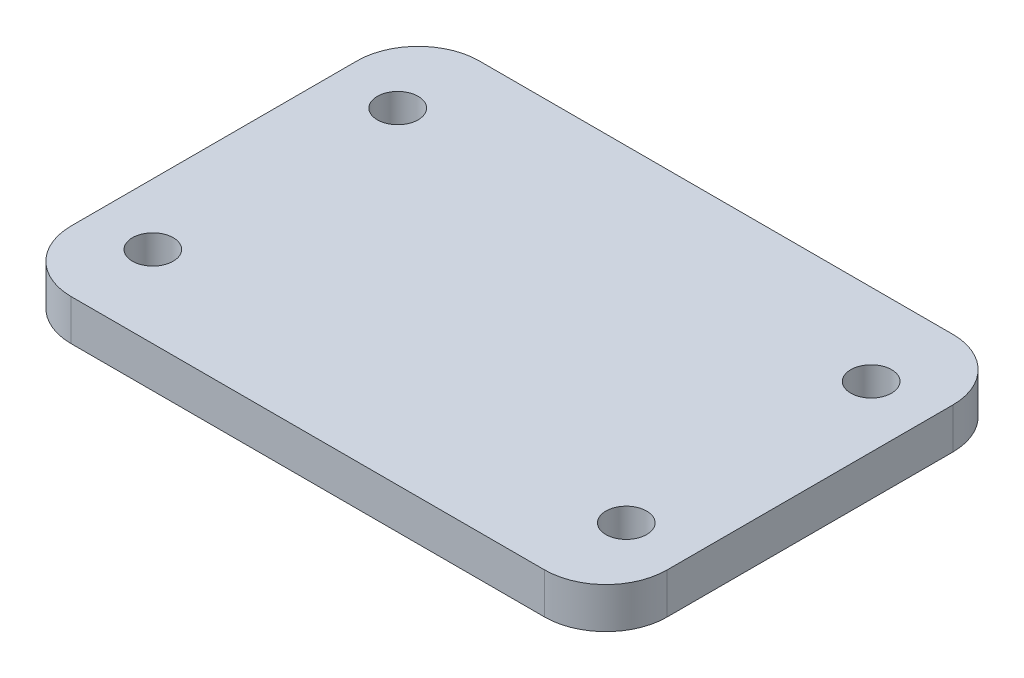
ISO-10303-21;
HEADER;
FILE_DESCRIPTION(('STEP AP214'),'2;1');
FILE_NAME('part.step','',(''),(''),'','','');
FILE_SCHEMA(('AUTOMOTIVE_DESIGN { 1 0 10303 214 1 1 1 1 }'));
ENDSEC;
DATA;
#1=APPLICATION_CONTEXT('core data for automotive mechanical design processes');
#2=APPLICATION_PROTOCOL_DEFINITION('international standard','automotive_design',2000,#1);
#3=PRODUCT_CONTEXT('',#1,'mechanical');
#4=PRODUCT('Part','Part','',(#3));
#5=PRODUCT_RELATED_PRODUCT_CATEGORY('part','',(#4));
#6=PRODUCT_DEFINITION_FORMATION('','',#4);
#7=PRODUCT_DEFINITION_CONTEXT('part definition',#1,'design');
#8=PRODUCT_DEFINITION('design','',#6,#7);
#9=PRODUCT_DEFINITION_SHAPE('','',#8);
#10=(LENGTH_UNIT() NAMED_UNIT(*) SI_UNIT(.MILLI.,.METRE.));
#11=(NAMED_UNIT(*) PLANE_ANGLE_UNIT() SI_UNIT($,.RADIAN.));
#12=(NAMED_UNIT(*) SI_UNIT($,.STERADIAN.) SOLID_ANGLE_UNIT());
#13=UNCERTAINTY_MEASURE_WITH_UNIT(LENGTH_MEASURE(1.E-05),#10,'distance_accuracy_value','');
#14=(GEOMETRIC_REPRESENTATION_CONTEXT(3) GLOBAL_UNCERTAINTY_ASSIGNED_CONTEXT((#13)) GLOBAL_UNIT_ASSIGNED_CONTEXT((#10,
#11,#12)) REPRESENTATION_CONTEXT('',''));
#15=CARTESIAN_POINT('',(0.,0.,0.));
#16=DIRECTION('',(0.,0.,1.));
#17=DIRECTION('',(1.,0.,0.));
#18=AXIS2_PLACEMENT_3D('',#15,#16,#17);
#19=CARTESIAN_POINT('',(58.,10.,-35.));
#20=DIRECTION('',(0.,-1.,0.));
#21=DIRECTION('',(0.,0.,-1.));
#22=AXIS2_PLACEMENT_3D('',#19,#20,#21);
#23=CYLINDRICAL_SURFACE('',#22,15.);
#24=CARTESIAN_POINT('',(58.,0.,-35.));
#25=DIRECTION('',(0.,1.,0.));
#26=DIRECTION('',(0.,0.,1.));
#27=AXIS2_PLACEMENT_3D('',#24,#25,#26);
#28=CIRCLE('',#27,15.);
#29=CARTESIAN_POINT('',(73.,0.,-34.9999999999999));
#30=VERTEX_POINT('',#29);
#31=CARTESIAN_POINT('',(57.9999999999999,0.,-50.));
#32=VERTEX_POINT('',#31);
#33=EDGE_CURVE('E137',#30,#32,#28,.T.);
#34=ORIENTED_EDGE('',*,*,#33,.T.);
#35=DIRECTION('',(0.,-1.,0.));
#36=VECTOR('',#35,1.);
#37=CARTESIAN_POINT('',(57.9999999999999,10.,-50.));
#38=LINE('',#37,#36);
#39=CARTESIAN_POINT('',(57.9999999999999,10.,-50.));
#40=VERTEX_POINT('',#39);
#41=EDGE_CURVE('E11',#40,#32,#38,.T.);
#42=ORIENTED_EDGE('',*,*,#41,.F.);
#43=CARTESIAN_POINT('',(58.,10.,-35.));
#44=DIRECTION('',(0.,1.,0.));
#45=DIRECTION('',(0.,0.,1.));
#46=AXIS2_PLACEMENT_3D('',#43,#44,#45);
#47=CIRCLE('',#46,15.);
#48=CARTESIAN_POINT('',(73.,10.,-34.9999999999999));
#49=VERTEX_POINT('',#48);
#50=EDGE_CURVE('E152',#49,#40,#47,.T.);
#51=ORIENTED_EDGE('',*,*,#50,.F.);
#52=DIRECTION('',(0.,-1.,0.));
#53=VECTOR('',#52,1.);
#54=CARTESIAN_POINT('',(73.,10.,-34.9999999999999));
#55=LINE('',#54,#53);
#56=EDGE_CURVE('E133',#49,#30,#55,.T.);
#57=ORIENTED_EDGE('',*,*,#56,.T.);
#58=EDGE_LOOP('',(#34,#42,#51,#57));
#59=FACE_BOUND('',#58,.T.);
#60=ADVANCED_FACE('F41',(#59),#23,.T.);
#61=CARTESIAN_POINT('',(57.9999999999999,10.,-50.));
#62=DIRECTION('',(0.,0.,1.));
#63=DIRECTION('',(1.,0.,0.));
#64=AXIS2_PLACEMENT_3D('',#61,#62,#63);
#65=PLANE('',#64);
#66=DIRECTION('',(-1.,0.,0.));
#67=VECTOR('',#66,1.);
#68=CARTESIAN_POINT('',(57.9999999999999,0.,-50.));
#69=LINE('',#68,#67);
#70=CARTESIAN_POINT('',(-57.9999999999999,0.,-50.));
#71=VERTEX_POINT('',#70);
#72=EDGE_CURVE('E140',#32,#71,#69,.T.);
#73=ORIENTED_EDGE('',*,*,#72,.T.);
#74=DIRECTION('',(0.,-1.,0.));
#75=VECTOR('',#74,1.);
#76=CARTESIAN_POINT('',(-57.9999999999999,10.,-50.));
#77=LINE('',#76,#75);
#78=CARTESIAN_POINT('',(-57.9999999999999,10.,-50.));
#79=VERTEX_POINT('',#78);
#80=EDGE_CURVE('E49',#79,#71,#77,.T.);
#81=ORIENTED_EDGE('',*,*,#80,.F.);
#82=DIRECTION('',(-1.,0.,0.));
#83=VECTOR('',#82,1.);
#84=CARTESIAN_POINT('',(57.9999999999999,10.,-50.));
#85=LINE('',#84,#83);
#86=EDGE_CURVE('E100',#40,#79,#85,.T.);
#87=ORIENTED_EDGE('',*,*,#86,.F.);
#88=ORIENTED_EDGE('',*,*,#41,.T.);
#89=EDGE_LOOP('',(#73,#81,#87,#88));
#90=FACE_BOUND('',#89,.T.);
#91=ADVANCED_FACE('F243',(#90),#65,.F.);
#92=CARTESIAN_POINT('',(-58.,10.,-35.));
#93=DIRECTION('',(0.,-1.,0.));
#94=DIRECTION('',(0.,0.,-1.));
#95=AXIS2_PLACEMENT_3D('',#92,#93,#94);
#96=CYLINDRICAL_SURFACE('',#95,15.);
#97=CARTESIAN_POINT('',(-58.,0.,-35.));
#98=DIRECTION('',(0.,1.,0.));
#99=DIRECTION('',(0.,0.,1.));
#100=AXIS2_PLACEMENT_3D('',#97,#98,#99);
#101=CIRCLE('',#100,15.);
#102=CARTESIAN_POINT('',(-73.,0.,-34.9999999999999));
#103=VERTEX_POINT('',#102);
#104=EDGE_CURVE('E143',#71,#103,#101,.T.);
#105=ORIENTED_EDGE('',*,*,#104,.T.);
#106=DIRECTION('',(0.,-1.,0.));
#107=VECTOR('',#106,1.);
#108=CARTESIAN_POINT('',(-73.,10.,-34.9999999999999));
#109=LINE('',#108,#107);
#110=CARTESIAN_POINT('',(-73.,10.,-34.9999999999999));
#111=VERTEX_POINT('',#110);
#112=EDGE_CURVE('E159',#111,#103,#109,.T.);
#113=ORIENTED_EDGE('',*,*,#112,.F.);
#114=CARTESIAN_POINT('',(-58.,10.,-35.));
#115=DIRECTION('',(0.,1.,0.));
#116=DIRECTION('',(0.,0.,1.));
#117=AXIS2_PLACEMENT_3D('',#114,#115,#116);
#118=CIRCLE('',#117,15.);
#119=EDGE_CURVE('E167',#79,#111,#118,.T.);
#120=ORIENTED_EDGE('',*,*,#119,.F.);
#121=ORIENTED_EDGE('',*,*,#80,.T.);
#122=EDGE_LOOP('',(#105,#113,#120,#121));
#123=FACE_BOUND('',#122,.T.);
#124=ADVANCED_FACE('F165',(#123),#96,.T.);
#125=CARTESIAN_POINT('',(-73.,10.,34.9999999999999));
#126=DIRECTION('',(1.,0.,0.));
#127=DIRECTION('',(0.,0.,-1.));
#128=AXIS2_PLACEMENT_3D('',#125,#126,#127);
#129=PLANE('',#128);
#130=DIRECTION('',(0.,0.,1.));
#131=VECTOR('',#130,1.);
#132=CARTESIAN_POINT('',(-73.,0.,34.9999999999999));
#133=LINE('',#132,#131);
#134=CARTESIAN_POINT('',(-73.,0.,34.9999999999999));
#135=VERTEX_POINT('',#134);
#136=EDGE_CURVE('E145',#103,#135,#133,.T.);
#137=ORIENTED_EDGE('',*,*,#136,.T.);
#138=DIRECTION('',(0.,-1.,0.));
#139=VECTOR('',#138,1.);
#140=CARTESIAN_POINT('',(-73.,10.,34.9999999999999));
#141=LINE('',#140,#139);
#142=CARTESIAN_POINT('',(-73.,10.,34.9999999999999));
#143=VERTEX_POINT('',#142);
#144=EDGE_CURVE('E156',#143,#135,#141,.T.);
#145=ORIENTED_EDGE('',*,*,#144,.F.);
#146=DIRECTION('',(0.,0.,1.));
#147=VECTOR('',#146,1.);
#148=CARTESIAN_POINT('',(-73.,10.,34.9999999999999));
#149=LINE('',#148,#147);
#150=EDGE_CURVE('E179',#111,#143,#149,.T.);
#151=ORIENTED_EDGE('',*,*,#150,.F.);
#152=ORIENTED_EDGE('',*,*,#112,.T.);
#153=EDGE_LOOP('',(#137,#145,#151,#152));
#154=FACE_BOUND('',#153,.T.);
#155=ADVANCED_FACE('F175',(#154),#129,.F.);
#156=CARTESIAN_POINT('',(-58.,10.,35.));
#157=DIRECTION('',(0.,-1.,0.));
#158=DIRECTION('',(0.,0.,-1.));
#159=AXIS2_PLACEMENT_3D('',#156,#157,#158);
#160=CYLINDRICAL_SURFACE('',#159,15.);
#161=CARTESIAN_POINT('',(-58.,0.,35.));
#162=DIRECTION('',(0.,1.,0.));
#163=DIRECTION('',(0.,0.,-1.));
#164=AXIS2_PLACEMENT_3D('',#161,#162,#163);
#165=CIRCLE('',#164,15.);
#166=CARTESIAN_POINT('',(-57.9999999999999,0.,50.));
#167=VERTEX_POINT('',#166);
#168=EDGE_CURVE('E147',#135,#167,#165,.T.);
#169=ORIENTED_EDGE('',*,*,#168,.T.);
#170=DIRECTION('',(0.,-1.,0.));
#171=VECTOR('',#170,1.);
#172=CARTESIAN_POINT('',(-57.9999999999999,10.,50.));
#173=LINE('',#172,#171);
#174=CARTESIAN_POINT('',(-57.9999999999999,10.,50.));
#175=VERTEX_POINT('',#174);
#176=EDGE_CURVE('E128',#175,#167,#173,.T.);
#177=ORIENTED_EDGE('',*,*,#176,.F.);
#178=CARTESIAN_POINT('',(-58.,10.,35.));
#179=DIRECTION('',(0.,1.,0.));
#180=DIRECTION('',(0.,0.,-1.));
#181=AXIS2_PLACEMENT_3D('',#178,#179,#180);
#182=CIRCLE('',#181,15.);
#183=EDGE_CURVE('E119',#143,#175,#182,.T.);
#184=ORIENTED_EDGE('',*,*,#183,.F.);
#185=ORIENTED_EDGE('',*,*,#144,.T.);
#186=EDGE_LOOP('',(#169,#177,#184,#185));
#187=FACE_BOUND('',#186,.T.);
#188=ADVANCED_FACE('F178',(#187),#160,.T.);
#189=CARTESIAN_POINT('',(57.9999999999999,10.,50.));
#190=DIRECTION('',(0.,0.,-1.));
#191=DIRECTION('',(-1.,0.,0.));
#192=AXIS2_PLACEMENT_3D('',#189,#190,#191);
#193=PLANE('',#192);
#194=DIRECTION('',(1.,0.,0.));
#195=VECTOR('',#194,1.);
#196=CARTESIAN_POINT('',(57.9999999999999,0.,50.));
#197=LINE('',#196,#195);
#198=CARTESIAN_POINT('',(57.9999999999999,0.,50.));
#199=VERTEX_POINT('',#198);
#200=EDGE_CURVE('E127',#167,#199,#197,.T.);
#201=ORIENTED_EDGE('',*,*,#200,.T.);
#202=DIRECTION('',(0.,-1.,0.));
#203=VECTOR('',#202,1.);
#204=CARTESIAN_POINT('',(57.9999999999999,10.,50.));
#205=LINE('',#204,#203);
#206=CARTESIAN_POINT('',(57.9999999999999,10.,50.));
#207=VERTEX_POINT('',#206);
#208=EDGE_CURVE('E124',#207,#199,#205,.T.);
#209=ORIENTED_EDGE('',*,*,#208,.F.);
#210=DIRECTION('',(1.,0.,0.));
#211=VECTOR('',#210,1.);
#212=CARTESIAN_POINT('',(57.9999999999999,10.,50.));
#213=LINE('',#212,#211);
#214=EDGE_CURVE('E113',#175,#207,#213,.T.);
#215=ORIENTED_EDGE('',*,*,#214,.F.);
#216=ORIENTED_EDGE('',*,*,#176,.T.);
#217=EDGE_LOOP('',(#201,#209,#215,#216));
#218=FACE_BOUND('',#217,.T.);
#219=ADVANCED_FACE('F125',(#218),#193,.F.);
#220=CARTESIAN_POINT('',(58.,10.,35.));
#221=DIRECTION('',(0.,-1.,0.));
#222=DIRECTION('',(0.,0.,-1.));
#223=AXIS2_PLACEMENT_3D('',#220,#221,#222);
#224=CYLINDRICAL_SURFACE('',#223,15.);
#225=CARTESIAN_POINT('',(58.,0.,35.));
#226=DIRECTION('',(0.,1.,0.));
#227=DIRECTION('',(0.,0.,1.));
#228=AXIS2_PLACEMENT_3D('',#225,#226,#227);
#229=CIRCLE('',#228,15.);
#230=CARTESIAN_POINT('',(73.,0.,34.9999999999999));
#231=VERTEX_POINT('',#230);
#232=EDGE_CURVE('E86',#199,#231,#229,.T.);
#233=ORIENTED_EDGE('',*,*,#232,.T.);
#234=DIRECTION('',(0.,-1.,0.));
#235=VECTOR('',#234,1.);
#236=CARTESIAN_POINT('',(73.,10.,34.9999999999999));
#237=LINE('',#236,#235);
#238=CARTESIAN_POINT('',(73.,10.,34.9999999999999));
#239=VERTEX_POINT('',#238);
#240=EDGE_CURVE('E129',#239,#231,#237,.T.);
#241=ORIENTED_EDGE('',*,*,#240,.F.);
#242=CARTESIAN_POINT('',(58.,10.,35.));
#243=DIRECTION('',(0.,1.,0.));
#244=DIRECTION('',(0.,0.,1.));
#245=AXIS2_PLACEMENT_3D('',#242,#243,#244);
#246=CIRCLE('',#245,15.);
#247=EDGE_CURVE('E117',#207,#239,#246,.T.);
#248=ORIENTED_EDGE('',*,*,#247,.F.);
#249=ORIENTED_EDGE('',*,*,#208,.T.);
#250=EDGE_LOOP('',(#233,#241,#248,#249));
#251=FACE_BOUND('',#250,.T.);
#252=ADVANCED_FACE('F131',(#251),#224,.T.);
#253=CARTESIAN_POINT('',(73.,10.,34.9999999999999));
#254=DIRECTION('',(-1.,0.,0.));
#255=DIRECTION('',(0.,0.,1.));
#256=AXIS2_PLACEMENT_3D('',#253,#254,#255);
#257=PLANE('',#256);
#258=DIRECTION('',(0.,0.,-1.));
#259=VECTOR('',#258,1.);
#260=CARTESIAN_POINT('',(73.,0.,34.9999999999999));
#261=LINE('',#260,#259);
#262=EDGE_CURVE('E92',#231,#30,#261,.T.);
#263=ORIENTED_EDGE('',*,*,#262,.T.);
#264=ORIENTED_EDGE('',*,*,#56,.F.);
#265=DIRECTION('',(0.,0.,-1.));
#266=VECTOR('',#265,1.);
#267=CARTESIAN_POINT('',(73.,10.,34.9999999999999));
#268=LINE('',#267,#266);
#269=EDGE_CURVE('E57',#239,#49,#268,.T.);
#270=ORIENTED_EDGE('',*,*,#269,.F.);
#271=ORIENTED_EDGE('',*,*,#240,.T.);
#272=EDGE_LOOP('',(#263,#264,#270,#271));
#273=FACE_BOUND('',#272,.T.);
#274=ADVANCED_FACE('F220',(#273),#257,.F.);
#275=CARTESIAN_POINT('',(58.,10.,-35.));
#276=DIRECTION('',(0.,1.,0.));
#277=DIRECTION('',(0.,0.,1.));
#278=AXIS2_PLACEMENT_3D('',#275,#276,#277);
#279=PLANE('',#278);
#280=CARTESIAN_POINT('',(-58.,10.,30.));
#281=DIRECTION('',(0.,1.,0.));
#282=DIRECTION('',(0.,0.,1.));
#283=AXIS2_PLACEMENT_3D('',#280,#281,#282);
#284=CIRCLE('',#283,5.);
#285=CARTESIAN_POINT('',(-58.,10.,35.));
#286=VERTEX_POINT('',#285);
#287=EDGE_CURVE('E203',#286,#286,#284,.T.);
#288=ORIENTED_EDGE('',*,*,#287,.F.);
#289=EDGE_LOOP('',(#288));
#290=FACE_BOUND('',#289,.T.);
#291=CARTESIAN_POINT('',(58.,10.,30.));
#292=DIRECTION('',(0.,1.,0.));
#293=DIRECTION('',(0.,0.,1.));
#294=AXIS2_PLACEMENT_3D('',#291,#292,#293);
#295=CIRCLE('',#294,5.);
#296=CARTESIAN_POINT('',(58.,10.,35.));
#297=VERTEX_POINT('',#296);
#298=EDGE_CURVE('E197',#297,#297,#295,.T.);
#299=ORIENTED_EDGE('',*,*,#298,.F.);
#300=EDGE_LOOP('',(#299));
#301=FACE_BOUND('',#300,.T.);
#302=CARTESIAN_POINT('',(58.,10.,-30.));
#303=DIRECTION('',(0.,1.,0.));
#304=DIRECTION('',(0.,0.,1.));
#305=AXIS2_PLACEMENT_3D('',#302,#303,#304);
#306=CIRCLE('',#305,5.);
#307=CARTESIAN_POINT('',(58.,10.,-25.));
#308=VERTEX_POINT('',#307);
#309=EDGE_CURVE('E191',#308,#308,#306,.T.);
#310=ORIENTED_EDGE('',*,*,#309,.F.);
#311=EDGE_LOOP('',(#310));
#312=FACE_BOUND('',#311,.T.);
#313=CARTESIAN_POINT('',(-58.,10.,-30.));
#314=DIRECTION('',(0.,1.,0.));
#315=DIRECTION('',(0.,0.,1.));
#316=AXIS2_PLACEMENT_3D('',#313,#314,#315);
#317=CIRCLE('',#316,5.);
#318=CARTESIAN_POINT('',(-58.,10.,-25.));
#319=VERTEX_POINT('',#318);
#320=EDGE_CURVE('E185',#319,#319,#317,.T.);
#321=ORIENTED_EDGE('',*,*,#320,.F.);
#322=EDGE_LOOP('',(#321));
#323=FACE_BOUND('',#322,.T.);
#324=ORIENTED_EDGE('',*,*,#50,.T.);
#325=ORIENTED_EDGE('',*,*,#86,.T.);
#326=ORIENTED_EDGE('',*,*,#119,.T.);
#327=ORIENTED_EDGE('',*,*,#150,.T.);
#328=ORIENTED_EDGE('',*,*,#183,.T.);
#329=ORIENTED_EDGE('',*,*,#214,.T.);
#330=ORIENTED_EDGE('',*,*,#247,.T.);
#331=ORIENTED_EDGE('',*,*,#269,.T.);
#332=EDGE_LOOP('',(#324,#325,#326,#327,#328,#329,#330,#331));
#333=FACE_BOUND('',#332,.T.);
#334=ADVANCED_FACE('F115',(#290,#301,#312,#323,#333),#279,.T.);
#335=CARTESIAN_POINT('',(58.,0.,-35.));
#336=DIRECTION('',(0.,1.,0.));
#337=DIRECTION('',(0.,0.,1.));
#338=AXIS2_PLACEMENT_3D('',#335,#336,#337);
#339=PLANE('',#338);
#340=CARTESIAN_POINT('',(-58.,0.,30.));
#341=DIRECTION('',(0.,1.,0.));
#342=DIRECTION('',(0.,0.,1.));
#343=AXIS2_PLACEMENT_3D('',#340,#341,#342);
#344=CIRCLE('',#343,5.);
#345=CARTESIAN_POINT('',(-58.,0.,35.));
#346=VERTEX_POINT('',#345);
#347=EDGE_CURVE('E194',#346,#346,#344,.T.);
#348=ORIENTED_EDGE('',*,*,#347,.T.);
#349=EDGE_LOOP('',(#348));
#350=FACE_BOUND('',#349,.T.);
#351=CARTESIAN_POINT('',(58.,0.,30.));
#352=DIRECTION('',(0.,1.,0.));
#353=DIRECTION('',(0.,0.,1.));
#354=AXIS2_PLACEMENT_3D('',#351,#352,#353);
#355=CIRCLE('',#354,5.);
#356=CARTESIAN_POINT('',(58.,0.,35.));
#357=VERTEX_POINT('',#356);
#358=EDGE_CURVE('E200',#357,#357,#355,.T.);
#359=ORIENTED_EDGE('',*,*,#358,.T.);
#360=EDGE_LOOP('',(#359));
#361=FACE_BOUND('',#360,.T.);
#362=CARTESIAN_POINT('',(58.,0.,-30.));
#363=DIRECTION('',(0.,1.,0.));
#364=DIRECTION('',(0.,0.,1.));
#365=AXIS2_PLACEMENT_3D('',#362,#363,#364);
#366=CIRCLE('',#365,5.);
#367=CARTESIAN_POINT('',(58.,0.,-25.));
#368=VERTEX_POINT('',#367);
#369=EDGE_CURVE('E188',#368,#368,#366,.T.);
#370=ORIENTED_EDGE('',*,*,#369,.T.);
#371=EDGE_LOOP('',(#370));
#372=FACE_BOUND('',#371,.T.);
#373=CARTESIAN_POINT('',(-58.,0.,-30.));
#374=DIRECTION('',(0.,1.,0.));
#375=DIRECTION('',(0.,0.,1.));
#376=AXIS2_PLACEMENT_3D('',#373,#374,#375);
#377=CIRCLE('',#376,5.);
#378=CARTESIAN_POINT('',(-58.,0.,-25.));
#379=VERTEX_POINT('',#378);
#380=EDGE_CURVE('E141',#379,#379,#377,.T.);
#381=ORIENTED_EDGE('',*,*,#380,.T.);
#382=EDGE_LOOP('',(#381));
#383=FACE_BOUND('',#382,.T.);
#384=ORIENTED_EDGE('',*,*,#33,.F.);
#385=ORIENTED_EDGE('',*,*,#262,.F.);
#386=ORIENTED_EDGE('',*,*,#232,.F.);
#387=ORIENTED_EDGE('',*,*,#200,.F.);
#388=ORIENTED_EDGE('',*,*,#168,.F.);
#389=ORIENTED_EDGE('',*,*,#136,.F.);
#390=ORIENTED_EDGE('',*,*,#104,.F.);
#391=ORIENTED_EDGE('',*,*,#72,.F.);
#392=EDGE_LOOP('',(#384,#385,#386,#387,#388,#389,#390,#391));
#393=FACE_BOUND('',#392,.T.);
#394=ADVANCED_FACE('F171',(#350,#361,#372,#383,#393),#339,.F.);
#395=CARTESIAN_POINT('',(-58.,0.,-30.));
#396=DIRECTION('',(0.,1.,0.));
#397=DIRECTION('',(0.,0.,1.));
#398=AXIS2_PLACEMENT_3D('',#395,#396,#397);
#399=CYLINDRICAL_SURFACE('',#398,5.);
#400=ORIENTED_EDGE('',*,*,#380,.F.);
#401=EDGE_LOOP('',(#400));
#402=FACE_BOUND('',#401,.T.);
#403=ORIENTED_EDGE('',*,*,#320,.T.);
#404=EDGE_LOOP('',(#403));
#405=FACE_BOUND('',#404,.T.);
#406=ADVANCED_FACE('F228',(#402,#405),#399,.F.);
#407=CARTESIAN_POINT('',(58.,0.,-30.));
#408=DIRECTION('',(0.,1.,0.));
#409=DIRECTION('',(0.,0.,1.));
#410=AXIS2_PLACEMENT_3D('',#407,#408,#409);
#411=CYLINDRICAL_SURFACE('',#410,5.);
#412=ORIENTED_EDGE('',*,*,#369,.F.);
#413=EDGE_LOOP('',(#412));
#414=FACE_BOUND('',#413,.T.);
#415=ORIENTED_EDGE('',*,*,#309,.T.);
#416=EDGE_LOOP('',(#415));
#417=FACE_BOUND('',#416,.T.);
#418=ADVANCED_FACE('F230',(#414,#417),#411,.F.);
#419=CARTESIAN_POINT('',(58.,0.,30.));
#420=DIRECTION('',(0.,1.,0.));
#421=DIRECTION('',(0.,0.,1.));
#422=AXIS2_PLACEMENT_3D('',#419,#420,#421);
#423=CYLINDRICAL_SURFACE('',#422,5.);
#424=ORIENTED_EDGE('',*,*,#358,.F.);
#425=EDGE_LOOP('',(#424));
#426=FACE_BOUND('',#425,.T.);
#427=ORIENTED_EDGE('',*,*,#298,.T.);
#428=EDGE_LOOP('',(#427));
#429=FACE_BOUND('',#428,.T.);
#430=ADVANCED_FACE('F214',(#426,#429),#423,.F.);
#431=CARTESIAN_POINT('',(-58.,0.,30.));
#432=DIRECTION('',(0.,1.,0.));
#433=DIRECTION('',(0.,0.,1.));
#434=AXIS2_PLACEMENT_3D('',#431,#432,#433);
#435=CYLINDRICAL_SURFACE('',#434,5.);
#436=ORIENTED_EDGE('',*,*,#347,.F.);
#437=EDGE_LOOP('',(#436));
#438=FACE_BOUND('',#437,.T.);
#439=ORIENTED_EDGE('',*,*,#287,.T.);
#440=EDGE_LOOP('',(#439));
#441=FACE_BOUND('',#440,.T.);
#442=ADVANCED_FACE('F211',(#438,#441),#435,.F.);
#443=CLOSED_SHELL('',(#60,#91,#124,#155,#188,#219,#252,#274,#334,#394,#406,#418,#430,#442));
#444=MANIFOLD_SOLID_BREP('B2',#443);
#445=ADVANCED_BREP_SHAPE_REPRESENTATION('',(#18,#444),#14);
#446=SHAPE_DEFINITION_REPRESENTATION(#9,#445);
ENDSEC;
END-ISO-10303-21;
